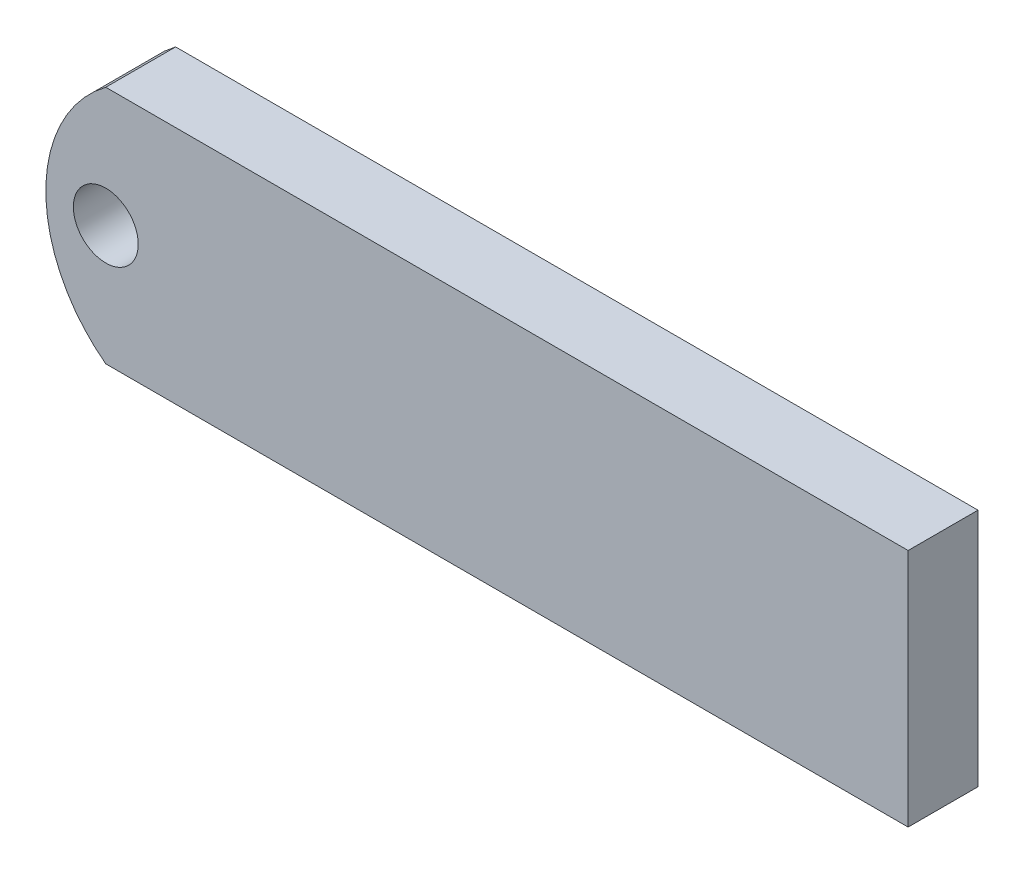
ISO-10303-21;
HEADER;
FILE_DESCRIPTION(('STEP AP214'),'2;1');
FILE_NAME('part.step','',(''),(''),'','','');
FILE_SCHEMA(('AUTOMOTIVE_DESIGN { 1 0 10303 214 1 1 1 1 }'));
ENDSEC;
DATA;
#1=APPLICATION_CONTEXT('core data for automotive mechanical design processes');
#2=APPLICATION_PROTOCOL_DEFINITION('international standard','automotive_design',2000,#1);
#3=PRODUCT_CONTEXT('',#1,'mechanical');
#4=PRODUCT('Part','Part','',(#3));
#5=PRODUCT_RELATED_PRODUCT_CATEGORY('part','',(#4));
#6=PRODUCT_DEFINITION_FORMATION('','',#4);
#7=PRODUCT_DEFINITION_CONTEXT('part definition',#1,'design');
#8=PRODUCT_DEFINITION('design','',#6,#7);
#9=PRODUCT_DEFINITION_SHAPE('','',#8);
#10=(LENGTH_UNIT() NAMED_UNIT(*) SI_UNIT(.MILLI.,.METRE.));
#11=(NAMED_UNIT(*) PLANE_ANGLE_UNIT() SI_UNIT($,.RADIAN.));
#12=(NAMED_UNIT(*) SI_UNIT($,.STERADIAN.) SOLID_ANGLE_UNIT());
#13=UNCERTAINTY_MEASURE_WITH_UNIT(LENGTH_MEASURE(1.E-05),#10,'distance_accuracy_value','');
#14=(GEOMETRIC_REPRESENTATION_CONTEXT(3) GLOBAL_UNCERTAINTY_ASSIGNED_CONTEXT((#13)) GLOBAL_UNIT_ASSIGNED_CONTEXT((#10,
#11,#12)) REPRESENTATION_CONTEXT('',''));
#15=CARTESIAN_POINT('',(0.,0.,0.));
#16=DIRECTION('',(0.,0.,1.));
#17=DIRECTION('',(1.,0.,0.));
#18=AXIS2_PLACEMENT_3D('',#15,#16,#17);
#19=CARTESIAN_POINT('',(8.98490695642361,0.,7.));
#20=DIRECTION('',(0.,0.,1.));
#21=DIRECTION('',(1.,0.,0.));
#22=AXIS2_PLACEMENT_3D('',#19,#20,#21);
#23=PLANE('',#22);
#24=CARTESIAN_POINT('',(8.98490695642361,0.,7.));
#25=DIRECTION('',(0.,0.,1.));
#26=DIRECTION('',(1.,0.,0.));
#27=AXIS2_PLACEMENT_3D('',#24,#25,#26);
#28=CIRCLE('',#27,14.9909490365217);
#29=CARTESIAN_POINT('',(0.,12.,7.));
#30=VERTEX_POINT('',#29);
#31=CARTESIAN_POINT('',(0.,-12.,7.));
#32=VERTEX_POINT('',#31);
#33=EDGE_CURVE('E85',#30,#32,#28,.T.);
#34=ORIENTED_EDGE('',*,*,#33,.T.);
#35=DIRECTION('',(1.,0.,0.));
#36=VECTOR('',#35,1.);
#37=CARTESIAN_POINT('',(80.3872427038062,-12.,7.));
#38=LINE('',#37,#36);
#39=CARTESIAN_POINT('',(80.3872427038062,-12.,7.));
#40=VERTEX_POINT('',#39);
#41=EDGE_CURVE('E80',#32,#40,#38,.T.);
#42=ORIENTED_EDGE('',*,*,#41,.T.);
#43=DIRECTION('',(0.,1.,0.));
#44=VECTOR('',#43,1.);
#45=CARTESIAN_POINT('',(80.3872427038062,12.,7.));
#46=LINE('',#45,#44);
#47=CARTESIAN_POINT('',(80.3872427038062,12.,7.));
#48=VERTEX_POINT('',#47);
#49=EDGE_CURVE('E83',#40,#48,#46,.T.);
#50=ORIENTED_EDGE('',*,*,#49,.T.);
#51=DIRECTION('',(-1.,0.,0.));
#52=VECTOR('',#51,1.);
#53=CARTESIAN_POINT('',(0.,12.,7.));
#54=LINE('',#53,#52);
#55=EDGE_CURVE('E50',#48,#30,#54,.T.);
#56=ORIENTED_EDGE('',*,*,#55,.T.);
#57=EDGE_LOOP('',(#34,#42,#50,#56));
#58=FACE_BOUND('',#57,.T.);
#59=CARTESIAN_POINT('',(0.,0.,7.));
#60=DIRECTION('',(0.,0.,1.));
#61=DIRECTION('',(1.,0.,0.));
#62=AXIS2_PLACEMENT_3D('',#59,#60,#61);
#63=CIRCLE('',#62,3.25);
#64=CARTESIAN_POINT('',(3.25,0.,7.));
#65=VERTEX_POINT('',#64);
#66=EDGE_CURVE('E100',#65,#65,#63,.T.);
#67=ORIENTED_EDGE('',*,*,#66,.F.);
#68=EDGE_LOOP('',(#67));
#69=FACE_BOUND('',#68,.T.);
#70=ADVANCED_FACE('F33',(#58,#69),#23,.T.);
#71=CARTESIAN_POINT('',(8.98490695642361,0.,0.));
#72=DIRECTION('',(0.,0.,1.));
#73=DIRECTION('',(1.,0.,0.));
#74=AXIS2_PLACEMENT_3D('',#71,#72,#73);
#75=PLANE('',#74);
#76=CARTESIAN_POINT('',(8.98490695642361,0.,0.));
#77=DIRECTION('',(0.,0.,1.));
#78=DIRECTION('',(1.,0.,0.));
#79=AXIS2_PLACEMENT_3D('',#76,#77,#78);
#80=CIRCLE('',#79,14.9909490365217);
#81=CARTESIAN_POINT('',(0.,12.,0.));
#82=VERTEX_POINT('',#81);
#83=CARTESIAN_POINT('',(0.,-12.,0.));
#84=VERTEX_POINT('',#83);
#85=EDGE_CURVE('E97',#82,#84,#80,.T.);
#86=ORIENTED_EDGE('',*,*,#85,.F.);
#87=DIRECTION('',(-1.,0.,0.));
#88=VECTOR('',#87,1.);
#89=CARTESIAN_POINT('',(0.,12.,0.));
#90=LINE('',#89,#88);
#91=CARTESIAN_POINT('',(80.3872427038062,12.,0.));
#92=VERTEX_POINT('',#91);
#93=EDGE_CURVE('E73',#92,#82,#90,.T.);
#94=ORIENTED_EDGE('',*,*,#93,.F.);
#95=DIRECTION('',(0.,1.,0.));
#96=VECTOR('',#95,1.);
#97=CARTESIAN_POINT('',(80.3872427038062,12.,0.));
#98=LINE('',#97,#96);
#99=CARTESIAN_POINT('',(80.3872427038062,-12.,0.));
#100=VERTEX_POINT('',#99);
#101=EDGE_CURVE('E67',#100,#92,#98,.T.);
#102=ORIENTED_EDGE('',*,*,#101,.F.);
#103=DIRECTION('',(1.,0.,0.));
#104=VECTOR('',#103,1.);
#105=CARTESIAN_POINT('',(80.3872427038062,-12.,0.));
#106=LINE('',#105,#104);
#107=EDGE_CURVE('E89',#84,#100,#106,.T.);
#108=ORIENTED_EDGE('',*,*,#107,.F.);
#109=EDGE_LOOP('',(#86,#94,#102,#108));
#110=FACE_BOUND('',#109,.T.);
#111=CARTESIAN_POINT('',(0.,0.,0.));
#112=DIRECTION('',(0.,0.,1.));
#113=DIRECTION('',(1.,0.,0.));
#114=AXIS2_PLACEMENT_3D('',#111,#112,#113);
#115=CIRCLE('',#114,3.25);
#116=CARTESIAN_POINT('',(3.25,0.,0.));
#117=VERTEX_POINT('',#116);
#118=EDGE_CURVE('E112',#117,#117,#115,.T.);
#119=ORIENTED_EDGE('',*,*,#118,.T.);
#120=EDGE_LOOP('',(#119));
#121=FACE_BOUND('',#120,.T.);
#122=ADVANCED_FACE('F108',(#110,#121),#75,.F.);
#123=CARTESIAN_POINT('',(8.98490695642361,0.,7.));
#124=DIRECTION('',(0.,0.,-1.));
#125=DIRECTION('',(-1.,0.,0.));
#126=AXIS2_PLACEMENT_3D('',#123,#124,#125);
#127=CYLINDRICAL_SURFACE('',#126,14.9909490365217);
#128=ORIENTED_EDGE('',*,*,#85,.T.);
#129=DIRECTION('',(0.,0.,-1.));
#130=VECTOR('',#129,1.);
#131=CARTESIAN_POINT('',(0.,-12.,7.));
#132=LINE('',#131,#130);
#133=EDGE_CURVE('E11',#32,#84,#132,.T.);
#134=ORIENTED_EDGE('',*,*,#133,.F.);
#135=ORIENTED_EDGE('',*,*,#33,.F.);
#136=DIRECTION('',(0.,0.,-1.));
#137=VECTOR('',#136,1.);
#138=CARTESIAN_POINT('',(0.,12.,7.));
#139=LINE('',#138,#137);
#140=EDGE_CURVE('E93',#30,#82,#139,.T.);
#141=ORIENTED_EDGE('',*,*,#140,.T.);
#142=EDGE_LOOP('',(#128,#134,#135,#141));
#143=FACE_BOUND('',#142,.T.);
#144=ADVANCED_FACE('F35',(#143),#127,.T.);
#145=CARTESIAN_POINT('',(80.3872427038062,-12.,7.));
#146=DIRECTION('',(0.,1.,0.));
#147=DIRECTION('',(-1.,0.,0.));
#148=AXIS2_PLACEMENT_3D('',#145,#146,#147);
#149=PLANE('',#148);
#150=ORIENTED_EDGE('',*,*,#107,.T.);
#151=DIRECTION('',(0.,0.,-1.));
#152=VECTOR('',#151,1.);
#153=CARTESIAN_POINT('',(80.3872427038062,-12.,7.));
#154=LINE('',#153,#152);
#155=EDGE_CURVE('E42',#40,#100,#154,.T.);
#156=ORIENTED_EDGE('',*,*,#155,.F.);
#157=ORIENTED_EDGE('',*,*,#41,.F.);
#158=ORIENTED_EDGE('',*,*,#133,.T.);
#159=EDGE_LOOP('',(#150,#156,#157,#158));
#160=FACE_BOUND('',#159,.T.);
#161=ADVANCED_FACE('F88',(#160),#149,.F.);
#162=CARTESIAN_POINT('',(80.3872427038062,12.,7.));
#163=DIRECTION('',(-1.,0.,0.));
#164=DIRECTION('',(0.,0.,1.));
#165=AXIS2_PLACEMENT_3D('',#162,#163,#164);
#166=PLANE('',#165);
#167=ORIENTED_EDGE('',*,*,#101,.T.);
#168=DIRECTION('',(0.,0.,-1.));
#169=VECTOR('',#168,1.);
#170=CARTESIAN_POINT('',(80.3872427038062,12.,7.));
#171=LINE('',#170,#169);
#172=EDGE_CURVE('E90',#48,#92,#171,.T.);
#173=ORIENTED_EDGE('',*,*,#172,.F.);
#174=ORIENTED_EDGE('',*,*,#49,.F.);
#175=ORIENTED_EDGE('',*,*,#155,.T.);
#176=EDGE_LOOP('',(#167,#173,#174,#175));
#177=FACE_BOUND('',#176,.T.);
#178=ADVANCED_FACE('F91',(#177),#166,.F.);
#179=CARTESIAN_POINT('',(0.,12.,7.));
#180=DIRECTION('',(0.,-1.,0.));
#181=DIRECTION('',(1.,0.,0.));
#182=AXIS2_PLACEMENT_3D('',#179,#180,#181);
#183=PLANE('',#182);
#184=ORIENTED_EDGE('',*,*,#93,.T.);
#185=ORIENTED_EDGE('',*,*,#140,.F.);
#186=ORIENTED_EDGE('',*,*,#55,.F.);
#187=ORIENTED_EDGE('',*,*,#172,.T.);
#188=EDGE_LOOP('',(#184,#185,#186,#187));
#189=FACE_BOUND('',#188,.T.);
#190=ADVANCED_FACE('F105',(#189),#183,.F.);
#191=CARTESIAN_POINT('',(0.,0.,7.));
#192=DIRECTION('',(0.,0.,-1.));
#193=DIRECTION('',(-1.,0.,0.));
#194=AXIS2_PLACEMENT_3D('',#191,#192,#193);
#195=CYLINDRICAL_SURFACE('',#194,3.25);
#196=ORIENTED_EDGE('',*,*,#66,.T.);
#197=EDGE_LOOP('',(#196));
#198=FACE_BOUND('',#197,.T.);
#199=ORIENTED_EDGE('',*,*,#118,.F.);
#200=EDGE_LOOP('',(#199));
#201=FACE_BOUND('',#200,.T.);
#202=ADVANCED_FACE('F118',(#198,#201),#195,.F.);
#203=CLOSED_SHELL('',(#70,#122,#144,#161,#178,#190,#202));
#204=MANIFOLD_SOLID_BREP('B2',#203);
#205=ADVANCED_BREP_SHAPE_REPRESENTATION('',(#18,#204),#14);
#206=SHAPE_DEFINITION_REPRESENTATION(#9,#205);
ENDSEC;
END-ISO-10303-21;
